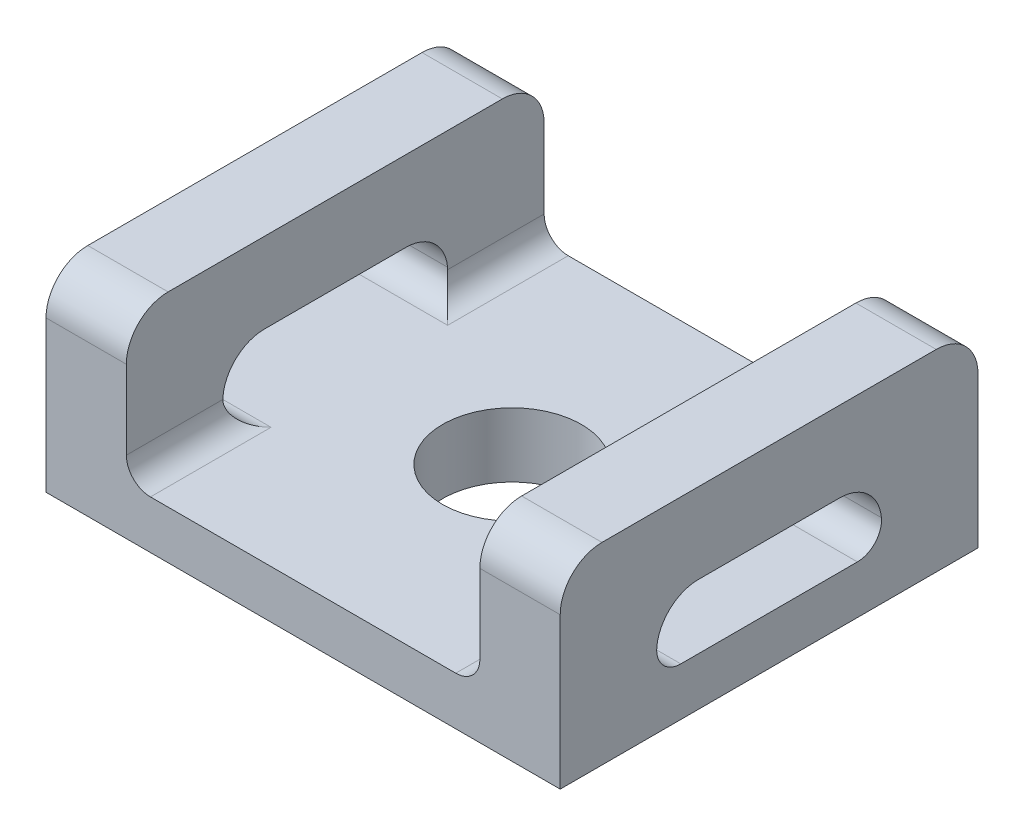
ISO-10303-21;
HEADER;
FILE_DESCRIPTION(('STEP AP214'),'2;1');
FILE_NAME('part.step','',(''),(''),'','','');
FILE_SCHEMA(('AUTOMOTIVE_DESIGN { 1 0 10303 214 1 1 1 1 }'));
ENDSEC;
DATA;
#1=APPLICATION_CONTEXT('core data for automotive mechanical design processes');
#2=APPLICATION_PROTOCOL_DEFINITION('international standard','automotive_design',2000,#1);
#3=PRODUCT_CONTEXT('',#1,'mechanical');
#4=PRODUCT('Part','Part','',(#3));
#5=PRODUCT_RELATED_PRODUCT_CATEGORY('part','',(#4));
#6=PRODUCT_DEFINITION_FORMATION('','',#4);
#7=PRODUCT_DEFINITION_CONTEXT('part definition',#1,'design');
#8=PRODUCT_DEFINITION('design','',#6,#7);
#9=PRODUCT_DEFINITION_SHAPE('','',#8);
#10=(LENGTH_UNIT() NAMED_UNIT(*) SI_UNIT(.MILLI.,.METRE.));
#11=(NAMED_UNIT(*) PLANE_ANGLE_UNIT() SI_UNIT($,.RADIAN.));
#12=(NAMED_UNIT(*) SI_UNIT($,.STERADIAN.) SOLID_ANGLE_UNIT());
#13=UNCERTAINTY_MEASURE_WITH_UNIT(LENGTH_MEASURE(1.E-05),#10,'distance_accuracy_value','');
#14=(GEOMETRIC_REPRESENTATION_CONTEXT(3) GLOBAL_UNCERTAINTY_ASSIGNED_CONTEXT((#13)) GLOBAL_UNIT_ASSIGNED_CONTEXT((#10,
#11,#12)) REPRESENTATION_CONTEXT('',''));
#15=CARTESIAN_POINT('',(0.,0.,0.));
#16=DIRECTION('',(0.,0.,1.));
#17=DIRECTION('',(1.,0.,0.));
#18=AXIS2_PLACEMENT_3D('',#15,#16,#17);
#19=CARTESIAN_POINT('',(-8.,5.2,5.2));
#20=DIRECTION('',(1.,0.,0.));
#21=DIRECTION('',(0.,0.,-1.));
#22=AXIS2_PLACEMENT_3D('',#19,#20,#21);
#23=CYLINDRICAL_SURFACE('',#22,1.3);
#24=DIRECTION('',(1.,0.,0.));
#25=VECTOR('',#24,1.);
#26=CARTESIAN_POINT('',(-8.,5.2,6.5));
#27=LINE('',#26,#25);
#28=CARTESIAN_POINT('',(-8.,5.2,6.5));
#29=VERTEX_POINT('',#28);
#30=CARTESIAN_POINT('',(-5.5,5.2,6.5));
#31=VERTEX_POINT('',#30);
#32=EDGE_CURVE('E290',#29,#31,#27,.T.);
#33=ORIENTED_EDGE('',*,*,#32,.T.);
#34=CARTESIAN_POINT('',(-5.5,5.2,5.2));
#35=DIRECTION('',(-1.,0.,0.));
#36=DIRECTION('',(0.,-1.,0.));
#37=AXIS2_PLACEMENT_3D('',#34,#35,#36);
#38=CIRCLE('',#37,1.3);
#39=CARTESIAN_POINT('',(-5.5,6.5,5.2));
#40=VERTEX_POINT('',#39);
#41=EDGE_CURVE('E508',#31,#40,#38,.T.);
#42=ORIENTED_EDGE('',*,*,#41,.T.);
#43=DIRECTION('',(1.,0.,0.));
#44=VECTOR('',#43,1.);
#45=CARTESIAN_POINT('',(-8.,6.5,5.2));
#46=LINE('',#45,#44);
#47=CARTESIAN_POINT('',(-8.,6.5,5.2));
#48=VERTEX_POINT('',#47);
#49=EDGE_CURVE('E304',#48,#40,#46,.T.);
#50=ORIENTED_EDGE('',*,*,#49,.F.);
#51=CARTESIAN_POINT('',(-8.,5.2,5.2));
#52=DIRECTION('',(1.,0.,0.));
#53=DIRECTION('',(0.,0.,-1.));
#54=AXIS2_PLACEMENT_3D('',#51,#52,#53);
#55=CIRCLE('',#54,1.3);
#56=EDGE_CURVE('E495',#29,#48,#55,.F.);
#57=ORIENTED_EDGE('',*,*,#56,.F.);
#58=EDGE_LOOP('',(#33,#42,#50,#57));
#59=FACE_BOUND('',#58,.T.);
#60=ADVANCED_FACE('F43',(#59),#23,.T.);
#61=CARTESIAN_POINT('',(-8.,6.5,0.));
#62=DIRECTION('',(0.,-1.,0.));
#63=DIRECTION('',(0.,0.,-1.));
#64=AXIS2_PLACEMENT_3D('',#61,#62,#63);
#65=PLANE('',#64);
#66=ORIENTED_EDGE('',*,*,#49,.T.);
#67=DIRECTION('',(0.,0.,-1.));
#68=VECTOR('',#67,1.);
#69=CARTESIAN_POINT('',(-5.5,6.5,0.));
#70=LINE('',#69,#68);
#71=CARTESIAN_POINT('',(-5.5,6.5,-5.2));
#72=VERTEX_POINT('',#71);
#73=EDGE_CURVE('E553',#40,#72,#70,.T.);
#74=ORIENTED_EDGE('',*,*,#73,.T.);
#75=DIRECTION('',(1.,0.,0.));
#76=VECTOR('',#75,1.);
#77=CARTESIAN_POINT('',(-8.,6.5,-5.2));
#78=LINE('',#77,#76);
#79=CARTESIAN_POINT('',(-8.,6.5,-5.2));
#80=VERTEX_POINT('',#79);
#81=EDGE_CURVE('E282',#80,#72,#78,.T.);
#82=ORIENTED_EDGE('',*,*,#81,.F.);
#83=DIRECTION('',(0.,0.,-1.));
#84=VECTOR('',#83,1.);
#85=CARTESIAN_POINT('',(-8.,6.5,0.));
#86=LINE('',#85,#84);
#87=EDGE_CURVE('E498',#48,#80,#86,.T.);
#88=ORIENTED_EDGE('',*,*,#87,.F.);
#89=EDGE_LOOP('',(#66,#74,#82,#88));
#90=FACE_BOUND('',#89,.T.);
#91=ADVANCED_FACE('F647',(#90),#65,.F.);
#92=CARTESIAN_POINT('',(-8.,5.2,-5.2));
#93=DIRECTION('',(1.,0.,0.));
#94=DIRECTION('',(0.,0.,-1.));
#95=AXIS2_PLACEMENT_3D('',#92,#93,#94);
#96=CYLINDRICAL_SURFACE('',#95,1.3);
#97=ORIENTED_EDGE('',*,*,#81,.T.);
#98=CARTESIAN_POINT('',(-5.5,5.2,-5.2));
#99=DIRECTION('',(-1.,0.,0.));
#100=DIRECTION('',(0.,-1.,0.));
#101=AXIS2_PLACEMENT_3D('',#98,#99,#100);
#102=CIRCLE('',#101,1.3);
#103=CARTESIAN_POINT('',(-5.5,5.2,-6.5));
#104=VERTEX_POINT('',#103);
#105=EDGE_CURVE('E556',#72,#104,#102,.T.);
#106=ORIENTED_EDGE('',*,*,#105,.T.);
#107=DIRECTION('',(1.,0.,0.));
#108=VECTOR('',#107,1.);
#109=CARTESIAN_POINT('',(-8.,5.2,-6.5));
#110=LINE('',#109,#108);
#111=CARTESIAN_POINT('',(-8.,5.2,-6.5));
#112=VERTEX_POINT('',#111);
#113=EDGE_CURVE('E271',#112,#104,#110,.T.);
#114=ORIENTED_EDGE('',*,*,#113,.F.);
#115=CARTESIAN_POINT('',(-8.,5.2,-5.2));
#116=DIRECTION('',(1.,0.,0.));
#117=DIRECTION('',(0.,0.,-1.));
#118=AXIS2_PLACEMENT_3D('',#115,#116,#117);
#119=CIRCLE('',#118,1.3);
#120=EDGE_CURVE('E536',#80,#112,#119,.F.);
#121=ORIENTED_EDGE('',*,*,#120,.F.);
#122=EDGE_LOOP('',(#97,#106,#114,#121));
#123=FACE_BOUND('',#122,.T.);
#124=ADVANCED_FACE('F646',(#123),#96,.T.);
#125=CARTESIAN_POINT('',(-8.,2.7,-2.2));
#126=DIRECTION('',(1.,0.,0.));
#127=DIRECTION('',(0.,0.,-1.));
#128=AXIS2_PLACEMENT_3D('',#125,#126,#127);
#129=CYLINDRICAL_SURFACE('',#128,1.3);
#130=CARTESIAN_POINT('',(-8.,2.7,-2.2));
#131=DIRECTION('',(1.,0.,0.));
#132=DIRECTION('',(0.,0.,-1.));
#133=AXIS2_PLACEMENT_3D('',#130,#131,#132);
#134=CIRCLE('',#133,1.3);
#135=CARTESIAN_POINT('',(-8.,2.81818181818182,-3.49461695410312));
#136=VERTEX_POINT('',#135);
#137=CARTESIAN_POINT('',(-8.,4.,-2.2));
#138=VERTEX_POINT('',#137);
#139=EDGE_CURVE('E539',#136,#138,#134,.T.);
#140=ORIENTED_EDGE('',*,*,#139,.F.);
#141=DIRECTION('',(1.,0.,0.));
#142=VECTOR('',#141,1.);
#143=CARTESIAN_POINT('',(-8.,2.81818181818182,-3.49461695410312));
#144=LINE('',#143,#142);
#145=CARTESIAN_POINT('',(-5.5,2.81818181818182,-3.49461695410312));
#146=VERTEX_POINT('',#145);
#147=EDGE_CURVE('E373',#136,#146,#144,.T.);
#148=ORIENTED_EDGE('',*,*,#147,.T.);
#149=CARTESIAN_POINT('',(-5.5,2.7,-2.2));
#150=DIRECTION('',(-1.,0.,0.));
#151=DIRECTION('',(0.,-1.,0.));
#152=AXIS2_PLACEMENT_3D('',#149,#150,#151);
#153=CIRCLE('',#152,1.3);
#154=CARTESIAN_POINT('',(-5.5,4.,-2.2));
#155=VERTEX_POINT('',#154);
#156=EDGE_CURVE('E560',#146,#155,#153,.F.);
#157=ORIENTED_EDGE('',*,*,#156,.T.);
#158=DIRECTION('',(1.,0.,0.));
#159=VECTOR('',#158,1.);
#160=CARTESIAN_POINT('',(-8.,4.,-2.2));
#161=LINE('',#160,#159);
#162=EDGE_CURVE('E272',#138,#155,#161,.T.);
#163=ORIENTED_EDGE('',*,*,#162,.F.);
#164=EDGE_LOOP('',(#140,#148,#157,#163));
#165=FACE_BOUND('',#164,.T.);
#166=ADVANCED_FACE('F678',(#165),#129,.F.);
#167=CARTESIAN_POINT('',(-8.,4.,0.));
#168=DIRECTION('',(0.,-1.,0.));
#169=DIRECTION('',(0.,0.,-1.));
#170=AXIS2_PLACEMENT_3D('',#167,#168,#169);
#171=PLANE('',#170);
#172=DIRECTION('',(0.,0.,-1.));
#173=VECTOR('',#172,1.);
#174=CARTESIAN_POINT('',(-5.5,4.,0.));
#175=LINE('',#174,#173);
#176=CARTESIAN_POINT('',(-5.5,4.,2.2));
#177=VERTEX_POINT('',#176);
#178=EDGE_CURVE('E563',#177,#155,#175,.T.);
#179=ORIENTED_EDGE('',*,*,#178,.F.);
#180=DIRECTION('',(1.,0.,0.));
#181=VECTOR('',#180,1.);
#182=CARTESIAN_POINT('',(-8.,4.,2.2));
#183=LINE('',#182,#181);
#184=CARTESIAN_POINT('',(-8.,4.,2.2));
#185=VERTEX_POINT('',#184);
#186=EDGE_CURVE('E285',#185,#177,#183,.T.);
#187=ORIENTED_EDGE('',*,*,#186,.F.);
#188=DIRECTION('',(0.,0.,-1.));
#189=VECTOR('',#188,1.);
#190=CARTESIAN_POINT('',(-8.,4.,0.));
#191=LINE('',#190,#189);
#192=EDGE_CURVE('E542',#185,#138,#191,.T.);
#193=ORIENTED_EDGE('',*,*,#192,.T.);
#194=ORIENTED_EDGE('',*,*,#162,.T.);
#195=EDGE_LOOP('',(#179,#187,#193,#194));
#196=FACE_BOUND('',#195,.T.);
#197=ADVANCED_FACE('F667',(#196),#171,.T.);
#198=CARTESIAN_POINT('',(-8.,2.7,2.2));
#199=DIRECTION('',(1.,0.,0.));
#200=DIRECTION('',(0.,0.,-1.));
#201=AXIS2_PLACEMENT_3D('',#198,#199,#200);
#202=CYLINDRICAL_SURFACE('',#201,1.3);
#203=CARTESIAN_POINT('',(-5.5,2.7,2.2));
#204=DIRECTION('',(-1.,0.,0.));
#205=DIRECTION('',(0.,-1.,0.));
#206=AXIS2_PLACEMENT_3D('',#203,#204,#205);
#207=CIRCLE('',#206,1.3);
#208=CARTESIAN_POINT('',(-5.5,2.81818181818182,3.49461695410312));
#209=VERTEX_POINT('',#208);
#210=EDGE_CURVE('E567',#177,#209,#207,.F.);
#211=ORIENTED_EDGE('',*,*,#210,.T.);
#212=DIRECTION('',(1.,0.,0.));
#213=VECTOR('',#212,1.);
#214=CARTESIAN_POINT('',(-8.,2.81818181818182,3.49461695410312));
#215=LINE('',#214,#213);
#216=CARTESIAN_POINT('',(-8.,2.81818181818182,3.49461695410312));
#217=VERTEX_POINT('',#216);
#218=EDGE_CURVE('E358',#209,#217,#215,.F.);
#219=ORIENTED_EDGE('',*,*,#218,.T.);
#220=CARTESIAN_POINT('',(-8.,2.7,2.2));
#221=DIRECTION('',(1.,0.,0.));
#222=DIRECTION('',(0.,0.,-1.));
#223=AXIS2_PLACEMENT_3D('',#220,#221,#222);
#224=CIRCLE('',#223,1.3);
#225=EDGE_CURVE('E502',#185,#217,#224,.T.);
#226=ORIENTED_EDGE('',*,*,#225,.F.);
#227=ORIENTED_EDGE('',*,*,#186,.T.);
#228=EDGE_LOOP('',(#211,#219,#226,#227));
#229=FACE_BOUND('',#228,.T.);
#230=ADVANCED_FACE('F663',(#229),#202,.F.);
#231=CARTESIAN_POINT('',(0.,2.,0.));
#232=DIRECTION('',(0.,-1.,0.));
#233=DIRECTION('',(0.,0.,-1.));
#234=AXIS2_PLACEMENT_3D('',#231,#232,#233);
#235=PLANE('',#234);
#236=DIRECTION('',(-1.,0.,0.));
#237=VECTOR('',#236,1.);
#238=CARTESIAN_POINT('',(-5.5,2.,2.74772255750517));
#239=LINE('',#238,#237);
#240=CARTESIAN_POINT('',(-8.,2.,2.74772255750517));
#241=VERTEX_POINT('',#240);
#242=CARTESIAN_POINT('',(-4.75,2.,2.74772255750517));
#243=VERTEX_POINT('',#242);
#244=EDGE_CURVE('E345',#241,#243,#239,.F.);
#245=ORIENTED_EDGE('',*,*,#244,.T.);
#246=DIRECTION('',(0.,0.,1.));
#247=VECTOR('',#246,1.);
#248=CARTESIAN_POINT('',(-4.75,2.,6.5));
#249=LINE('',#248,#247);
#250=CARTESIAN_POINT('',(-4.75,2.,6.5));
#251=VERTEX_POINT('',#250);
#252=EDGE_CURVE('E348',#243,#251,#249,.T.);
#253=ORIENTED_EDGE('',*,*,#252,.T.);
#254=DIRECTION('',(-1.,0.,0.));
#255=VECTOR('',#254,1.);
#256=CARTESIAN_POINT('',(-8.,2.,6.5));
#257=LINE('',#256,#255);
#258=CARTESIAN_POINT('',(4.75,2.,6.5));
#259=VERTEX_POINT('',#258);
#260=EDGE_CURVE('E252',#259,#251,#257,.T.);
#261=ORIENTED_EDGE('',*,*,#260,.F.);
#262=DIRECTION('',(0.,0.,1.));
#263=VECTOR('',#262,1.);
#264=CARTESIAN_POINT('',(4.75,2.,3.5));
#265=LINE('',#264,#263);
#266=CARTESIAN_POINT('',(4.75,2.,2.74772255750517));
#267=VERTEX_POINT('',#266);
#268=EDGE_CURVE('E338',#259,#267,#265,.F.);
#269=ORIENTED_EDGE('',*,*,#268,.T.);
#270=DIRECTION('',(-1.,0.,0.));
#271=VECTOR('',#270,1.);
#272=CARTESIAN_POINT('',(8.,2.,2.74772255750517));
#273=LINE('',#272,#271);
#274=CARTESIAN_POINT('',(8.,2.,2.74772255750517));
#275=VERTEX_POINT('',#274);
#276=EDGE_CURVE('E341',#267,#275,#273,.F.);
#277=ORIENTED_EDGE('',*,*,#276,.T.);
#278=DIRECTION('',(0.,0.,-1.));
#279=VECTOR('',#278,1.);
#280=CARTESIAN_POINT('',(8.,2.,6.5));
#281=LINE('',#280,#279);
#282=CARTESIAN_POINT('',(8.,2.,-2.74772255750516));
#283=VERTEX_POINT('',#282);
#284=EDGE_CURVE('E299',#275,#283,#281,.T.);
#285=ORIENTED_EDGE('',*,*,#284,.T.);
#286=DIRECTION('',(-1.,0.,0.));
#287=VECTOR('',#286,1.);
#288=CARTESIAN_POINT('',(5.5,2.,-2.74772255750516));
#289=LINE('',#288,#287);
#290=CARTESIAN_POINT('',(4.75,2.,-2.74772255750516));
#291=VERTEX_POINT('',#290);
#292=EDGE_CURVE('E332',#283,#291,#289,.T.);
#293=ORIENTED_EDGE('',*,*,#292,.T.);
#294=DIRECTION('',(0.,0.,1.));
#295=VECTOR('',#294,1.);
#296=CARTESIAN_POINT('',(4.75,2.,-6.5));
#297=LINE('',#296,#295);
#298=CARTESIAN_POINT('',(4.75,2.,-6.5));
#299=VERTEX_POINT('',#298);
#300=EDGE_CURVE('E335',#291,#299,#297,.F.);
#301=ORIENTED_EDGE('',*,*,#300,.T.);
#302=DIRECTION('',(1.,0.,0.));
#303=VECTOR('',#302,1.);
#304=CARTESIAN_POINT('',(-5.5,2.,-6.5));
#305=LINE('',#304,#303);
#306=CARTESIAN_POINT('',(-4.75,2.,-6.5));
#307=VERTEX_POINT('',#306);
#308=EDGE_CURVE('E253',#307,#299,#305,.T.);
#309=ORIENTED_EDGE('',*,*,#308,.F.);
#310=DIRECTION('',(0.,0.,1.));
#311=VECTOR('',#310,1.);
#312=CARTESIAN_POINT('',(-4.75,2.,-3.5));
#313=LINE('',#312,#311);
#314=CARTESIAN_POINT('',(-4.75,2.,-2.74772255750516));
#315=VERTEX_POINT('',#314);
#316=EDGE_CURVE('E328',#307,#315,#313,.T.);
#317=ORIENTED_EDGE('',*,*,#316,.T.);
#318=DIRECTION('',(-1.,0.,0.));
#319=VECTOR('',#318,1.);
#320=CARTESIAN_POINT('',(-8.,2.,-2.74772255750516));
#321=LINE('',#320,#319);
#322=CARTESIAN_POINT('',(-8.,2.,-2.74772255750516));
#323=VERTEX_POINT('',#322);
#324=EDGE_CURVE('E325',#315,#323,#321,.T.);
#325=ORIENTED_EDGE('',*,*,#324,.T.);
#326=DIRECTION('',(0.,0.,1.));
#327=VECTOR('',#326,1.);
#328=CARTESIAN_POINT('',(-8.,2.,6.5));
#329=LINE('',#328,#327);
#330=EDGE_CURVE('E308',#323,#241,#329,.T.);
#331=ORIENTED_EDGE('',*,*,#330,.T.);
#332=EDGE_LOOP('',(#245,#253,#261,#269,#277,#285,#293,#301,#309,#317,#325,#331));
#333=FACE_BOUND('',#332,.T.);
#334=CARTESIAN_POINT('',(0.,2.,0.));
#335=DIRECTION('',(0.,1.,0.));
#336=DIRECTION('',(0.,0.,1.));
#337=AXIS2_PLACEMENT_3D('',#334,#335,#336);
#338=CIRCLE('',#337,2.159);
#339=CARTESIAN_POINT('',(0.,2.,2.159));
#340=VERTEX_POINT('',#339);
#341=EDGE_CURVE('E295',#340,#340,#338,.T.);
#342=ORIENTED_EDGE('',*,*,#341,.F.);
#343=EDGE_LOOP('',(#342));
#344=FACE_BOUND('',#343,.T.);
#345=ADVANCED_FACE('F607',(#333,#344),#235,.F.);
#346=CARTESIAN_POINT('',(0.,0.,0.));
#347=DIRECTION('',(0.,-1.,0.));
#348=DIRECTION('',(0.,0.,-1.));
#349=AXIS2_PLACEMENT_3D('',#346,#347,#348);
#350=PLANE('',#349);
#351=DIRECTION('',(1.,0.,0.));
#352=VECTOR('',#351,1.);
#353=CARTESIAN_POINT('',(8.,0.,-6.));
#354=LINE('',#353,#352);
#355=CARTESIAN_POINT('',(-7.5,0.,-6.));
#356=VERTEX_POINT('',#355);
#357=CARTESIAN_POINT('',(7.5,0.,-6.));
#358=VERTEX_POINT('',#357);
#359=EDGE_CURVE('E432',#356,#358,#354,.T.);
#360=ORIENTED_EDGE('',*,*,#359,.T.);
#361=DIRECTION('',(0.,0.,1.));
#362=VECTOR('',#361,1.);
#363=CARTESIAN_POINT('',(7.5,0.,6.5));
#364=LINE('',#363,#362);
#365=CARTESIAN_POINT('',(7.5,0.,6.));
#366=VERTEX_POINT('',#365);
#367=EDGE_CURVE('E441',#358,#366,#364,.T.);
#368=ORIENTED_EDGE('',*,*,#367,.T.);
#369=DIRECTION('',(-1.,0.,0.));
#370=VECTOR('',#369,1.);
#371=CARTESIAN_POINT('',(-8.,0.,6.));
#372=LINE('',#371,#370);
#373=CARTESIAN_POINT('',(-7.5,0.,6.));
#374=VERTEX_POINT('',#373);
#375=EDGE_CURVE('E438',#366,#374,#372,.T.);
#376=ORIENTED_EDGE('',*,*,#375,.T.);
#377=DIRECTION('',(0.,0.,-1.));
#378=VECTOR('',#377,1.);
#379=CARTESIAN_POINT('',(-7.5,0.,-6.5));
#380=LINE('',#379,#378);
#381=EDGE_CURVE('E435',#374,#356,#380,.T.);
#382=ORIENTED_EDGE('',*,*,#381,.T.);
#383=EDGE_LOOP('',(#360,#368,#376,#382));
#384=FACE_BOUND('',#383,.T.);
#385=CARTESIAN_POINT('',(0.,0.,0.));
#386=DIRECTION('',(0.,1.,0.));
#387=DIRECTION('',(0.,0.,1.));
#388=AXIS2_PLACEMENT_3D('',#385,#386,#387);
#389=CIRCLE('',#388,2.159);
#390=CARTESIAN_POINT('',(0.,0.,2.159));
#391=VERTEX_POINT('',#390);
#392=EDGE_CURVE('E300',#391,#391,#389,.T.);
#393=ORIENTED_EDGE('',*,*,#392,.T.);
#394=EDGE_LOOP('',(#393));
#395=FACE_BOUND('',#394,.T.);
#396=ADVANCED_FACE('F472',(#384,#395),#350,.T.);
#397=CARTESIAN_POINT('',(8.,2.,6.5));
#398=DIRECTION('',(-1.,0.,0.));
#399=DIRECTION('',(0.,0.,1.));
#400=AXIS2_PLACEMENT_3D('',#397,#398,#399);
#401=PLANE('',#400);
#402=CARTESIAN_POINT('',(8.,2.7,-2.2));
#403=DIRECTION('',(1.,0.,0.));
#404=DIRECTION('',(0.,0.,-1.));
#405=AXIS2_PLACEMENT_3D('',#402,#403,#404);
#406=CIRCLE('',#405,1.3);
#407=CARTESIAN_POINT('',(8.,2.81818181818182,-3.49461695410312));
#408=VERTEX_POINT('',#407);
#409=CARTESIAN_POINT('',(8.,4.,-2.2));
#410=VERTEX_POINT('',#409);
#411=EDGE_CURVE('E520',#408,#410,#406,.T.);
#412=ORIENTED_EDGE('',*,*,#411,.F.);
#413=CARTESIAN_POINT('',(8.,2.75,-2.74772255750516));
#414=DIRECTION('',(-1.,0.,0.));
#415=DIRECTION('',(0.,0.,1.));
#416=AXIS2_PLACEMENT_3D('',#413,#414,#415);
#417=CIRCLE('',#416,0.75);
#418=EDGE_CURVE('E396',#408,#283,#417,.T.);
#419=ORIENTED_EDGE('',*,*,#418,.T.);
#420=ORIENTED_EDGE('',*,*,#284,.F.);
#421=CARTESIAN_POINT('',(8.,2.75,2.74772255750517));
#422=DIRECTION('',(-1.,0.,0.));
#423=DIRECTION('',(0.,0.,1.));
#424=AXIS2_PLACEMENT_3D('',#421,#422,#423);
#425=CIRCLE('',#424,0.75);
#426=CARTESIAN_POINT('',(8.,2.81818181818182,3.49461695410312));
#427=VERTEX_POINT('',#426);
#428=EDGE_CURVE('E385',#275,#427,#425,.T.);
#429=ORIENTED_EDGE('',*,*,#428,.T.);
#430=CARTESIAN_POINT('',(8.,2.7,2.2));
#431=DIRECTION('',(1.,0.,0.));
#432=DIRECTION('',(0.,0.,-1.));
#433=AXIS2_PLACEMENT_3D('',#430,#431,#432);
#434=CIRCLE('',#433,1.3);
#435=CARTESIAN_POINT('',(8.,4.,2.2));
#436=VERTEX_POINT('',#435);
#437=EDGE_CURVE('E527',#436,#427,#434,.T.);
#438=ORIENTED_EDGE('',*,*,#437,.F.);
#439=DIRECTION('',(0.,0.,-1.));
#440=VECTOR('',#439,1.);
#441=CARTESIAN_POINT('',(8.,4.,0.));
#442=LINE('',#441,#440);
#443=EDGE_CURVE('E523',#436,#410,#442,.T.);
#444=ORIENTED_EDGE('',*,*,#443,.T.);
#445=EDGE_LOOP('',(#412,#419,#420,#429,#438,#444));
#446=FACE_BOUND('',#445,.T.);
#447=DIRECTION('',(0.,-1.,0.));
#448=VECTOR('',#447,1.);
#449=CARTESIAN_POINT('',(8.,2.,6.5));
#450=LINE('',#449,#448);
#451=CARTESIAN_POINT('',(8.,5.2,6.5));
#452=VERTEX_POINT('',#451);
#453=CARTESIAN_POINT('',(8.,0.5,6.5));
#454=VERTEX_POINT('',#453);
#455=EDGE_CURVE('E312',#452,#454,#450,.T.);
#456=ORIENTED_EDGE('',*,*,#455,.T.);
#457=DIRECTION('',(0.,0.,-1.));
#458=VECTOR('',#457,1.);
#459=CARTESIAN_POINT('',(8.,0.5,-6.5));
#460=LINE('',#459,#458);
#461=CARTESIAN_POINT('',(8.,0.5,-6.5));
#462=VERTEX_POINT('',#461);
#463=EDGE_CURVE('E412',#454,#462,#460,.T.);
#464=ORIENTED_EDGE('',*,*,#463,.T.);
#465=DIRECTION('',(0.,-1.,0.));
#466=VECTOR('',#465,1.);
#467=CARTESIAN_POINT('',(8.,2.,-6.5));
#468=LINE('',#467,#466);
#469=CARTESIAN_POINT('',(8.,5.2,-6.5));
#470=VERTEX_POINT('',#469);
#471=EDGE_CURVE('E322',#470,#462,#468,.T.);
#472=ORIENTED_EDGE('',*,*,#471,.F.);
#473=CARTESIAN_POINT('',(8.,5.2,-5.2));
#474=DIRECTION('',(1.,0.,0.));
#475=DIRECTION('',(0.,0.,-1.));
#476=AXIS2_PLACEMENT_3D('',#473,#474,#475);
#477=CIRCLE('',#476,1.3);
#478=CARTESIAN_POINT('',(8.,6.5,-5.2));
#479=VERTEX_POINT('',#478);
#480=EDGE_CURVE('E269',#479,#470,#477,.F.);
#481=ORIENTED_EDGE('',*,*,#480,.F.);
#482=DIRECTION('',(0.,0.,-1.));
#483=VECTOR('',#482,1.);
#484=CARTESIAN_POINT('',(8.,6.5,0.));
#485=LINE('',#484,#483);
#486=CARTESIAN_POINT('',(8.,6.5,5.2));
#487=VERTEX_POINT('',#486);
#488=EDGE_CURVE('E503',#487,#479,#485,.T.);
#489=ORIENTED_EDGE('',*,*,#488,.F.);
#490=CARTESIAN_POINT('',(8.,5.2,5.2));
#491=DIRECTION('',(1.,0.,0.));
#492=DIRECTION('',(0.,0.,-1.));
#493=AXIS2_PLACEMENT_3D('',#490,#491,#492);
#494=CIRCLE('',#493,1.3);
#495=EDGE_CURVE('E486',#452,#487,#494,.F.);
#496=ORIENTED_EDGE('',*,*,#495,.F.);
#497=EDGE_LOOP('',(#456,#464,#472,#481,#489,#496));
#498=FACE_BOUND('',#497,.T.);
#499=ADVANCED_FACE('F481',(#446,#498),#401,.F.);
#500=CARTESIAN_POINT('',(-8.,2.,-6.5));
#501=DIRECTION('',(0.,0.,1.));
#502=DIRECTION('',(1.,0.,0.));
#503=AXIS2_PLACEMENT_3D('',#500,#501,#502);
#504=PLANE('',#503);
#505=ORIENTED_EDGE('',*,*,#471,.T.);
#506=DIRECTION('',(-1.,0.,0.));
#507=VECTOR('',#506,1.);
#508=CARTESIAN_POINT('',(-8.,0.5,-6.5));
#509=LINE('',#508,#507);
#510=CARTESIAN_POINT('',(-8.,0.5,-6.5));
#511=VERTEX_POINT('',#510);
#512=EDGE_CURVE('E11',#462,#511,#509,.T.);
#513=ORIENTED_EDGE('',*,*,#512,.T.);
#514=DIRECTION('',(0.,-1.,0.));
#515=VECTOR('',#514,1.);
#516=CARTESIAN_POINT('',(-8.,2.,-6.5));
#517=LINE('',#516,#515);
#518=EDGE_CURVE('E319',#112,#511,#517,.T.);
#519=ORIENTED_EDGE('',*,*,#518,.F.);
#520=ORIENTED_EDGE('',*,*,#113,.T.);
#521=DIRECTION('',(0.,-1.,0.));
#522=VECTOR('',#521,1.);
#523=CARTESIAN_POINT('',(-5.5,7.,-6.5));
#524=LINE('',#523,#522);
#525=CARTESIAN_POINT('',(-5.5,2.75,-6.5));
#526=VERTEX_POINT('',#525);
#527=EDGE_CURVE('E417',#104,#526,#524,.T.);
#528=ORIENTED_EDGE('',*,*,#527,.T.);
#529=CARTESIAN_POINT('',(-4.75,2.75,-6.5));
#530=DIRECTION('',(0.,0.,1.));
#531=DIRECTION('',(1.,0.,0.));
#532=AXIS2_PLACEMENT_3D('',#529,#530,#531);
#533=CIRCLE('',#532,0.75);
#534=EDGE_CURVE('E402',#526,#307,#533,.T.);
#535=ORIENTED_EDGE('',*,*,#534,.T.);
#536=ORIENTED_EDGE('',*,*,#308,.T.);
#537=CARTESIAN_POINT('',(4.75,2.75,-6.5));
#538=DIRECTION('',(0.,0.,1.));
#539=DIRECTION('',(1.,0.,0.));
#540=AXIS2_PLACEMENT_3D('',#537,#538,#539);
#541=CIRCLE('',#540,0.75);
#542=CARTESIAN_POINT('',(5.5,2.75,-6.5));
#543=VERTEX_POINT('',#542);
#544=EDGE_CURVE('E248',#299,#543,#541,.T.);
#545=ORIENTED_EDGE('',*,*,#544,.T.);
#546=DIRECTION('',(0.,1.,0.));
#547=VECTOR('',#546,1.);
#548=CARTESIAN_POINT('',(5.5,7.,-6.5));
#549=LINE('',#548,#547);
#550=CARTESIAN_POINT('',(5.5,5.2,-6.5));
#551=VERTEX_POINT('',#550);
#552=EDGE_CURVE('E240',#543,#551,#549,.T.);
#553=ORIENTED_EDGE('',*,*,#552,.T.);
#554=EDGE_CURVE('E244',#551,#470,#110,.T.);
#555=ORIENTED_EDGE('',*,*,#554,.T.);
#556=EDGE_LOOP('',(#505,#513,#519,#520,#528,#535,#536,#545,#553,#555));
#557=FACE_BOUND('',#556,.T.);
#558=ADVANCED_FACE('F242',(#557),#504,.F.);
#559=CARTESIAN_POINT('',(-8.,2.,6.5));
#560=DIRECTION('',(1.,0.,0.));
#561=DIRECTION('',(0.,0.,-1.));
#562=AXIS2_PLACEMENT_3D('',#559,#560,#561);
#563=PLANE('',#562);
#564=ORIENTED_EDGE('',*,*,#330,.F.);
#565=CARTESIAN_POINT('',(-8.,2.75,-2.74772255750516));
#566=DIRECTION('',(1.,0.,0.));
#567=DIRECTION('',(0.,0.,-1.));
#568=AXIS2_PLACEMENT_3D('',#565,#566,#567);
#569=CIRCLE('',#568,0.75);
#570=EDGE_CURVE('E409',#323,#136,#569,.T.);
#571=ORIENTED_EDGE('',*,*,#570,.T.);
#572=ORIENTED_EDGE('',*,*,#139,.T.);
#573=ORIENTED_EDGE('',*,*,#192,.F.);
#574=ORIENTED_EDGE('',*,*,#225,.T.);
#575=CARTESIAN_POINT('',(-8.,2.75,2.74772255750517));
#576=DIRECTION('',(1.,0.,0.));
#577=DIRECTION('',(0.,0.,-1.));
#578=AXIS2_PLACEMENT_3D('',#575,#576,#577);
#579=CIRCLE('',#578,0.75);
#580=EDGE_CURVE('E382',#217,#241,#579,.T.);
#581=ORIENTED_EDGE('',*,*,#580,.T.);
#582=EDGE_LOOP('',(#564,#571,#572,#573,#574,#581));
#583=FACE_BOUND('',#582,.T.);
#584=ORIENTED_EDGE('',*,*,#518,.T.);
#585=DIRECTION('',(0.,0.,1.));
#586=VECTOR('',#585,1.);
#587=CARTESIAN_POINT('',(-8.,0.5,6.5));
#588=LINE('',#587,#586);
#589=CARTESIAN_POINT('',(-8.,0.5,6.5));
#590=VERTEX_POINT('',#589);
#591=EDGE_CURVE('E54',#511,#590,#588,.T.);
#592=ORIENTED_EDGE('',*,*,#591,.T.);
#593=DIRECTION('',(0.,-1.,0.));
#594=VECTOR('',#593,1.);
#595=CARTESIAN_POINT('',(-8.,2.,6.5));
#596=LINE('',#595,#594);
#597=EDGE_CURVE('E316',#29,#590,#596,.T.);
#598=ORIENTED_EDGE('',*,*,#597,.F.);
#599=ORIENTED_EDGE('',*,*,#56,.T.);
#600=ORIENTED_EDGE('',*,*,#87,.T.);
#601=ORIENTED_EDGE('',*,*,#120,.T.);
#602=EDGE_LOOP('',(#584,#592,#598,#599,#600,#601));
#603=FACE_BOUND('',#602,.T.);
#604=ADVANCED_FACE('F494',(#583,#603),#563,.F.);
#605=CARTESIAN_POINT('',(-8.,2.,6.5));
#606=DIRECTION('',(0.,0.,-1.));
#607=DIRECTION('',(-1.,0.,0.));
#608=AXIS2_PLACEMENT_3D('',#605,#606,#607);
#609=PLANE('',#608);
#610=ORIENTED_EDGE('',*,*,#597,.T.);
#611=DIRECTION('',(1.,0.,0.));
#612=VECTOR('',#611,1.);
#613=CARTESIAN_POINT('',(8.,0.5,6.5));
#614=LINE('',#613,#612);
#615=EDGE_CURVE('E445',#590,#454,#614,.T.);
#616=ORIENTED_EDGE('',*,*,#615,.T.);
#617=ORIENTED_EDGE('',*,*,#455,.F.);
#618=CARTESIAN_POINT('',(5.5,5.2,6.5));
#619=VERTEX_POINT('',#618);
#620=EDGE_CURVE('E294',#619,#452,#27,.T.);
#621=ORIENTED_EDGE('',*,*,#620,.F.);
#622=DIRECTION('',(0.,-1.,0.));
#623=VECTOR('',#622,1.);
#624=CARTESIAN_POINT('',(5.5,2.,6.5));
#625=LINE('',#624,#623);
#626=CARTESIAN_POINT('',(5.5,2.75,6.5));
#627=VERTEX_POINT('',#626);
#628=EDGE_CURVE('E571',#619,#627,#625,.T.);
#629=ORIENTED_EDGE('',*,*,#628,.T.);
#630=CARTESIAN_POINT('',(4.75,2.75,6.5));
#631=DIRECTION('',(0.,0.,-1.));
#632=DIRECTION('',(-1.,0.,0.));
#633=AXIS2_PLACEMENT_3D('',#630,#631,#632);
#634=CIRCLE('',#633,0.75);
#635=EDGE_CURVE('E391',#627,#259,#634,.T.);
#636=ORIENTED_EDGE('',*,*,#635,.T.);
#637=ORIENTED_EDGE('',*,*,#260,.T.);
#638=CARTESIAN_POINT('',(-4.75,2.75,6.5));
#639=DIRECTION('',(0.,0.,-1.));
#640=DIRECTION('',(-1.,0.,0.));
#641=AXIS2_PLACEMENT_3D('',#638,#639,#640);
#642=CIRCLE('',#641,0.75);
#643=CARTESIAN_POINT('',(-5.5,2.75,6.5));
#644=VERTEX_POINT('',#643);
#645=EDGE_CURVE('E376',#251,#644,#642,.T.);
#646=ORIENTED_EDGE('',*,*,#645,.T.);
#647=DIRECTION('',(0.,1.,0.));
#648=VECTOR('',#647,1.);
#649=CARTESIAN_POINT('',(-5.5,2.,6.5));
#650=LINE('',#649,#648);
#651=EDGE_CURVE('E533',#644,#31,#650,.T.);
#652=ORIENTED_EDGE('',*,*,#651,.T.);
#653=ORIENTED_EDGE('',*,*,#32,.F.);
#654=EDGE_LOOP('',(#610,#616,#617,#621,#629,#636,#637,#646,#652,#653));
#655=FACE_BOUND('',#654,.T.);
#656=ADVANCED_FACE('F489',(#655),#609,.F.);
#657=CARTESIAN_POINT('',(0.,2.,0.));
#658=DIRECTION('',(0.,-1.,0.));
#659=DIRECTION('',(0.,0.,-1.));
#660=AXIS2_PLACEMENT_3D('',#657,#658,#659);
#661=CYLINDRICAL_SURFACE('',#660,2.159);
#662=ORIENTED_EDGE('',*,*,#341,.T.);
#663=EDGE_LOOP('',(#662));
#664=FACE_BOUND('',#663,.T.);
#665=ORIENTED_EDGE('',*,*,#392,.F.);
#666=EDGE_LOOP('',(#665));
#667=FACE_BOUND('',#666,.T.);
#668=ADVANCED_FACE('F697',(#664,#667),#661,.F.);
#669=CARTESIAN_POINT('',(5.5,6.5,5.2));
#670=VERTEX_POINT('',#669);
#671=EDGE_CURVE('E512',#670,#487,#46,.T.);
#672=ORIENTED_EDGE('',*,*,#671,.F.);
#673=CARTESIAN_POINT('',(5.5,5.2,5.2));
#674=DIRECTION('',(1.,0.,0.));
#675=DIRECTION('',(0.,1.,0.));
#676=AXIS2_PLACEMENT_3D('',#673,#674,#675);
#677=CIRCLE('',#676,1.3);
#678=EDGE_CURVE('E574',#670,#619,#677,.T.);
#679=ORIENTED_EDGE('',*,*,#678,.T.);
#680=ORIENTED_EDGE('',*,*,#620,.T.);
#681=ORIENTED_EDGE('',*,*,#495,.T.);
#682=EDGE_LOOP('',(#672,#679,#680,#681));
#683=FACE_BOUND('',#682,.T.);
#684=ADVANCED_FACE('F638',(#683),#23,.T.);
#685=CARTESIAN_POINT('',(5.5,6.5,-5.2));
#686=VERTEX_POINT('',#685);
#687=EDGE_CURVE('E277',#686,#479,#78,.T.);
#688=ORIENTED_EDGE('',*,*,#687,.F.);
#689=DIRECTION('',(0.,0.,1.));
#690=VECTOR('',#689,1.);
#691=CARTESIAN_POINT('',(5.5,6.5,0.));
#692=LINE('',#691,#690);
#693=EDGE_CURVE('E260',#686,#670,#692,.T.);
#694=ORIENTED_EDGE('',*,*,#693,.T.);
#695=ORIENTED_EDGE('',*,*,#671,.T.);
#696=ORIENTED_EDGE('',*,*,#488,.T.);
#697=EDGE_LOOP('',(#688,#694,#695,#696));
#698=FACE_BOUND('',#697,.T.);
#699=ADVANCED_FACE('F640',(#698),#65,.F.);
#700=ORIENTED_EDGE('',*,*,#554,.F.);
#701=CARTESIAN_POINT('',(5.5,5.2,-5.2));
#702=DIRECTION('',(1.,0.,0.));
#703=DIRECTION('',(0.,1.,0.));
#704=AXIS2_PLACEMENT_3D('',#701,#702,#703);
#705=CIRCLE('',#704,1.3);
#706=EDGE_CURVE('E256',#551,#686,#705,.T.);
#707=ORIENTED_EDGE('',*,*,#706,.T.);
#708=ORIENTED_EDGE('',*,*,#687,.T.);
#709=ORIENTED_EDGE('',*,*,#480,.T.);
#710=EDGE_LOOP('',(#700,#707,#708,#709));
#711=FACE_BOUND('',#710,.T.);
#712=ADVANCED_FACE('F267',(#711),#96,.T.);
#713=CARTESIAN_POINT('',(5.5,2.7,-2.2));
#714=DIRECTION('',(1.,0.,0.));
#715=DIRECTION('',(0.,1.,0.));
#716=AXIS2_PLACEMENT_3D('',#713,#714,#715);
#717=CIRCLE('',#716,1.3);
#718=CARTESIAN_POINT('',(5.5,4.,-2.2));
#719=VERTEX_POINT('',#718);
#720=CARTESIAN_POINT('',(5.5,2.81818181818182,-3.49461695410312));
#721=VERTEX_POINT('',#720);
#722=EDGE_CURVE('E264',#719,#721,#717,.F.);
#723=ORIENTED_EDGE('',*,*,#722,.T.);
#724=DIRECTION('',(1.,0.,0.));
#725=VECTOR('',#724,1.);
#726=CARTESIAN_POINT('',(-8.,2.81818181818182,-3.49461695410312));
#727=LINE('',#726,#725);
#728=EDGE_CURVE('E370',#721,#408,#727,.T.);
#729=ORIENTED_EDGE('',*,*,#728,.T.);
#730=ORIENTED_EDGE('',*,*,#411,.T.);
#731=EDGE_CURVE('E279',#719,#410,#161,.T.);
#732=ORIENTED_EDGE('',*,*,#731,.F.);
#733=EDGE_LOOP('',(#723,#729,#730,#732));
#734=FACE_BOUND('',#733,.T.);
#735=ADVANCED_FACE('F622',(#734),#129,.F.);
#736=DIRECTION('',(0.,0.,1.));
#737=VECTOR('',#736,1.);
#738=CARTESIAN_POINT('',(5.5,4.,0.));
#739=LINE('',#738,#737);
#740=CARTESIAN_POINT('',(5.5,4.,2.2));
#741=VERTEX_POINT('',#740);
#742=EDGE_CURVE('E583',#719,#741,#739,.T.);
#743=ORIENTED_EDGE('',*,*,#742,.F.);
#744=ORIENTED_EDGE('',*,*,#731,.T.);
#745=ORIENTED_EDGE('',*,*,#443,.F.);
#746=EDGE_CURVE('E289',#741,#436,#183,.T.);
#747=ORIENTED_EDGE('',*,*,#746,.F.);
#748=EDGE_LOOP('',(#743,#744,#745,#747));
#749=FACE_BOUND('',#748,.T.);
#750=ADVANCED_FACE('F632',(#749),#171,.T.);
#751=ORIENTED_EDGE('',*,*,#437,.T.);
#752=DIRECTION('',(1.,0.,0.));
#753=VECTOR('',#752,1.);
#754=CARTESIAN_POINT('',(-8.,2.81818181818182,3.49461695410312));
#755=LINE('',#754,#753);
#756=CARTESIAN_POINT('',(5.5,2.81818181818182,3.49461695410312));
#757=VERTEX_POINT('',#756);
#758=EDGE_CURVE('E361',#427,#757,#755,.F.);
#759=ORIENTED_EDGE('',*,*,#758,.T.);
#760=CARTESIAN_POINT('',(5.5,2.7,2.2));
#761=DIRECTION('',(1.,0.,0.));
#762=DIRECTION('',(0.,1.,0.));
#763=AXIS2_PLACEMENT_3D('',#760,#761,#762);
#764=CIRCLE('',#763,1.3);
#765=EDGE_CURVE('E587',#757,#741,#764,.F.);
#766=ORIENTED_EDGE('',*,*,#765,.T.);
#767=ORIENTED_EDGE('',*,*,#746,.T.);
#768=EDGE_LOOP('',(#751,#759,#766,#767));
#769=FACE_BOUND('',#768,.T.);
#770=ADVANCED_FACE('F803',(#769),#202,.F.);
#771=CARTESIAN_POINT('',(-5.5,7.,-6.5));
#772=DIRECTION('',(-1.,0.,0.));
#773=DIRECTION('',(0.,-1.,0.));
#774=AXIS2_PLACEMENT_3D('',#771,#772,#773);
#775=PLANE('',#774);
#776=ORIENTED_EDGE('',*,*,#651,.F.);
#777=DIRECTION('',(0.,0.,1.));
#778=VECTOR('',#777,1.);
#779=CARTESIAN_POINT('',(-5.5,2.75,3.5));
#780=LINE('',#779,#778);
#781=CARTESIAN_POINT('',(-5.5,2.75,3.49772255750517));
#782=VERTEX_POINT('',#781);
#783=EDGE_CURVE('E355',#644,#782,#780,.F.);
#784=ORIENTED_EDGE('',*,*,#783,.T.);
#785=CARTESIAN_POINT('',(-5.5,2.75,2.74772255750517));
#786=DIRECTION('',(-1.,0.,0.));
#787=DIRECTION('',(0.,-1.,0.));
#788=AXIS2_PLACEMENT_3D('',#785,#786,#787);
#789=CIRCLE('',#788,0.75);
#790=EDGE_CURVE('E379',#782,#209,#789,.T.);
#791=ORIENTED_EDGE('',*,*,#790,.T.);
#792=ORIENTED_EDGE('',*,*,#210,.F.);
#793=ORIENTED_EDGE('',*,*,#178,.T.);
#794=ORIENTED_EDGE('',*,*,#156,.F.);
#795=CARTESIAN_POINT('',(-5.5,2.75,-2.74772255750516));
#796=DIRECTION('',(-1.,0.,0.));
#797=DIRECTION('',(0.,-1.,0.));
#798=AXIS2_PLACEMENT_3D('',#795,#796,#797);
#799=CIRCLE('',#798,0.75);
#800=CARTESIAN_POINT('',(-5.5,2.75,-3.49772255750516));
#801=VERTEX_POINT('',#800);
#802=EDGE_CURVE('E405',#146,#801,#799,.T.);
#803=ORIENTED_EDGE('',*,*,#802,.T.);
#804=DIRECTION('',(0.,0.,1.));
#805=VECTOR('',#804,1.);
#806=CARTESIAN_POINT('',(-5.5,2.75,-6.5));
#807=LINE('',#806,#805);
#808=EDGE_CURVE('E352',#801,#526,#807,.F.);
#809=ORIENTED_EDGE('',*,*,#808,.T.);
#810=ORIENTED_EDGE('',*,*,#527,.F.);
#811=ORIENTED_EDGE('',*,*,#105,.F.);
#812=ORIENTED_EDGE('',*,*,#73,.F.);
#813=ORIENTED_EDGE('',*,*,#41,.F.);
#814=EDGE_LOOP('',(#776,#784,#791,#792,#793,#794,#803,#809,#810,#811,#812,#813));
#815=FACE_BOUND('',#814,.T.);
#816=ADVANCED_FACE('F649',(#815),#775,.F.);
#817=CARTESIAN_POINT('',(5.5,7.,-6.5));
#818=DIRECTION('',(1.,0.,0.));
#819=DIRECTION('',(0.,1.,0.));
#820=AXIS2_PLACEMENT_3D('',#817,#818,#819);
#821=PLANE('',#820);
#822=CARTESIAN_POINT('',(5.5,2.75,2.74772255750517));
#823=DIRECTION('',(1.,0.,0.));
#824=DIRECTION('',(0.,1.,0.));
#825=AXIS2_PLACEMENT_3D('',#822,#823,#824);
#826=CIRCLE('',#825,0.75);
#827=CARTESIAN_POINT('',(5.5,2.75,3.49772255750517));
#828=VERTEX_POINT('',#827);
#829=EDGE_CURVE('E388',#757,#828,#826,.T.);
#830=ORIENTED_EDGE('',*,*,#829,.T.);
#831=DIRECTION('',(0.,0.,1.));
#832=VECTOR('',#831,1.);
#833=CARTESIAN_POINT('',(5.5,2.75,6.5));
#834=LINE('',#833,#832);
#835=EDGE_CURVE('E367',#828,#627,#834,.T.);
#836=ORIENTED_EDGE('',*,*,#835,.T.);
#837=ORIENTED_EDGE('',*,*,#628,.F.);
#838=ORIENTED_EDGE('',*,*,#678,.F.);
#839=ORIENTED_EDGE('',*,*,#693,.F.);
#840=ORIENTED_EDGE('',*,*,#706,.F.);
#841=ORIENTED_EDGE('',*,*,#552,.F.);
#842=DIRECTION('',(0.,0.,1.));
#843=VECTOR('',#842,1.);
#844=CARTESIAN_POINT('',(5.5,2.75,-3.5));
#845=LINE('',#844,#843);
#846=CARTESIAN_POINT('',(5.5,2.75,-3.49772255750516));
#847=VERTEX_POINT('',#846);
#848=EDGE_CURVE('E364',#543,#847,#845,.T.);
#849=ORIENTED_EDGE('',*,*,#848,.T.);
#850=CARTESIAN_POINT('',(5.5,2.75,-2.74772255750516));
#851=DIRECTION('',(1.,0.,0.));
#852=DIRECTION('',(0.,1.,0.));
#853=AXIS2_PLACEMENT_3D('',#850,#851,#852);
#854=CIRCLE('',#853,0.75);
#855=EDGE_CURVE('E399',#847,#721,#854,.T.);
#856=ORIENTED_EDGE('',*,*,#855,.T.);
#857=ORIENTED_EDGE('',*,*,#722,.F.);
#858=ORIENTED_EDGE('',*,*,#742,.T.);
#859=ORIENTED_EDGE('',*,*,#765,.F.);
#860=EDGE_LOOP('',(#830,#836,#837,#838,#839,#840,#841,#849,#856,#857,#858,#859));
#861=FACE_BOUND('',#860,.T.);
#862=ADVANCED_FACE('F258',(#861),#821,.F.);
#863=CARTESIAN_POINT('',(-8.,2.75,2.74772255750517));
#864=DIRECTION('',(1.,0.,0.));
#865=DIRECTION('',(0.,0.,-1.));
#866=AXIS2_PLACEMENT_3D('',#863,#864,#865);
#867=CYLINDRICAL_SURFACE('',#866,0.75);
#868=ORIENTED_EDGE('',*,*,#218,.F.);
#869=ORIENTED_EDGE('',*,*,#790,.F.);
#870=CARTESIAN_POINT('',(-4.75,2.75,2.74772255750517));
#871=DIRECTION('',(0.707106781186547,0.,0.707106781186547));
#872=DIRECTION('',(0.707106781186547,0.,-0.707106781186547));
#873=AXIS2_PLACEMENT_3D('',#870,#871,#872);
#874=ELLIPSE('',#873,1.06066017177982,0.75);
#875=EDGE_CURVE('E413',#243,#782,#874,.F.);
#876=ORIENTED_EDGE('',*,*,#875,.F.);
#877=ORIENTED_EDGE('',*,*,#244,.F.);
#878=ORIENTED_EDGE('',*,*,#580,.F.);
#879=EDGE_LOOP('',(#868,#869,#876,#877,#878));
#880=FACE_BOUND('',#879,.T.);
#881=ADVANCED_FACE('F659',(#880),#867,.F.);
#882=CARTESIAN_POINT('',(-4.75,2.75,0.));
#883=DIRECTION('',(0.,0.,-1.));
#884=DIRECTION('',(-1.,0.,0.));
#885=AXIS2_PLACEMENT_3D('',#882,#883,#884);
#886=CYLINDRICAL_SURFACE('',#885,0.75);
#887=ORIENTED_EDGE('',*,*,#875,.T.);
#888=ORIENTED_EDGE('',*,*,#783,.F.);
#889=ORIENTED_EDGE('',*,*,#645,.F.);
#890=ORIENTED_EDGE('',*,*,#252,.F.);
#891=EDGE_LOOP('',(#887,#888,#889,#890));
#892=FACE_BOUND('',#891,.T.);
#893=ADVANCED_FACE('F653',(#892),#886,.F.);
#894=CARTESIAN_POINT('',(4.75,2.75,-6.5));
#895=DIRECTION('',(0.,0.,-1.));
#896=DIRECTION('',(-1.,0.,0.));
#897=AXIS2_PLACEMENT_3D('',#894,#895,#896);
#898=CYLINDRICAL_SURFACE('',#897,0.75);
#899=ORIENTED_EDGE('',*,*,#835,.F.);
#900=CARTESIAN_POINT('',(4.75,2.75,2.74772255750517));
#901=DIRECTION('',(0.707106781186547,0.,-0.707106781186547));
#902=DIRECTION('',(-0.707106781186547,0.,-0.707106781186547));
#903=AXIS2_PLACEMENT_3D('',#900,#901,#902);
#904=ELLIPSE('',#903,1.06066017177982,0.75);
#905=EDGE_CURVE('E418',#267,#828,#904,.F.);
#906=ORIENTED_EDGE('',*,*,#905,.F.);
#907=ORIENTED_EDGE('',*,*,#268,.F.);
#908=ORIENTED_EDGE('',*,*,#635,.F.);
#909=EDGE_LOOP('',(#899,#906,#907,#908));
#910=FACE_BOUND('',#909,.T.);
#911=ADVANCED_FACE('F721',(#910),#898,.F.);
#912=CARTESIAN_POINT('',(-8.,2.75,2.74772255750517));
#913=DIRECTION('',(1.,0.,0.));
#914=DIRECTION('',(0.,0.,-1.));
#915=AXIS2_PLACEMENT_3D('',#912,#913,#914);
#916=CYLINDRICAL_SURFACE('',#915,0.75);
#917=ORIENTED_EDGE('',*,*,#829,.F.);
#918=ORIENTED_EDGE('',*,*,#758,.F.);
#919=ORIENTED_EDGE('',*,*,#428,.F.);
#920=ORIENTED_EDGE('',*,*,#276,.F.);
#921=ORIENTED_EDGE('',*,*,#905,.T.);
#922=EDGE_LOOP('',(#917,#918,#919,#920,#921));
#923=FACE_BOUND('',#922,.T.);
#924=ADVANCED_FACE('F724',(#923),#916,.F.);
#925=CARTESIAN_POINT('',(-8.,2.75,-2.74772255750516));
#926=DIRECTION('',(1.,0.,0.));
#927=DIRECTION('',(0.,0.,-1.));
#928=AXIS2_PLACEMENT_3D('',#925,#926,#927);
#929=CYLINDRICAL_SURFACE('',#928,0.75);
#930=ORIENTED_EDGE('',*,*,#728,.F.);
#931=ORIENTED_EDGE('',*,*,#855,.F.);
#932=CARTESIAN_POINT('',(4.75,2.75,-2.74772255750516));
#933=DIRECTION('',(0.707106781186547,0.,0.707106781186547));
#934=DIRECTION('',(0.707106781186547,0.,-0.707106781186547));
#935=AXIS2_PLACEMENT_3D('',#932,#933,#934);
#936=ELLIPSE('',#935,1.06066017177982,0.75);
#937=EDGE_CURVE('E422',#291,#847,#936,.T.);
#938=ORIENTED_EDGE('',*,*,#937,.F.);
#939=ORIENTED_EDGE('',*,*,#292,.F.);
#940=ORIENTED_EDGE('',*,*,#418,.F.);
#941=EDGE_LOOP('',(#930,#931,#938,#939,#940));
#942=FACE_BOUND('',#941,.T.);
#943=ADVANCED_FACE('F617',(#942),#929,.F.);
#944=CARTESIAN_POINT('',(4.75,2.75,-6.5));
#945=DIRECTION('',(0.,0.,-1.));
#946=DIRECTION('',(-1.,0.,0.));
#947=AXIS2_PLACEMENT_3D('',#944,#945,#946);
#948=CYLINDRICAL_SURFACE('',#947,0.75);
#949=ORIENTED_EDGE('',*,*,#544,.F.);
#950=ORIENTED_EDGE('',*,*,#300,.F.);
#951=ORIENTED_EDGE('',*,*,#937,.T.);
#952=ORIENTED_EDGE('',*,*,#848,.F.);
#953=EDGE_LOOP('',(#949,#950,#951,#952));
#954=FACE_BOUND('',#953,.T.);
#955=ADVANCED_FACE('F612',(#954),#948,.F.);
#956=CARTESIAN_POINT('',(-8.,2.75,-2.74772255750516));
#957=DIRECTION('',(1.,0.,0.));
#958=DIRECTION('',(0.,0.,-1.));
#959=AXIS2_PLACEMENT_3D('',#956,#957,#958);
#960=CYLINDRICAL_SURFACE('',#959,0.75);
#961=ORIENTED_EDGE('',*,*,#570,.F.);
#962=ORIENTED_EDGE('',*,*,#324,.F.);
#963=CARTESIAN_POINT('',(-4.75,2.75,-2.74772255750516));
#964=DIRECTION('',(0.707106781186547,0.,-0.707106781186547));
#965=DIRECTION('',(0.707106781186547,0.,0.707106781186547));
#966=AXIS2_PLACEMENT_3D('',#963,#964,#965);
#967=ELLIPSE('',#966,1.06066017177982,0.75);
#968=EDGE_CURVE('E426',#801,#315,#967,.F.);
#969=ORIENTED_EDGE('',*,*,#968,.F.);
#970=ORIENTED_EDGE('',*,*,#802,.F.);
#971=ORIENTED_EDGE('',*,*,#147,.F.);
#972=EDGE_LOOP('',(#961,#962,#969,#970,#971));
#973=FACE_BOUND('',#972,.T.);
#974=ADVANCED_FACE('F675',(#973),#960,.F.);
#975=CARTESIAN_POINT('',(-4.75,2.75,0.));
#976=DIRECTION('',(0.,0.,-1.));
#977=DIRECTION('',(-1.,0.,0.));
#978=AXIS2_PLACEMENT_3D('',#975,#976,#977);
#979=CYLINDRICAL_SURFACE('',#978,0.75);
#980=ORIENTED_EDGE('',*,*,#534,.F.);
#981=ORIENTED_EDGE('',*,*,#808,.F.);
#982=ORIENTED_EDGE('',*,*,#968,.T.);
#983=ORIENTED_EDGE('',*,*,#316,.F.);
#984=EDGE_LOOP('',(#980,#981,#982,#983));
#985=FACE_BOUND('',#984,.T.);
#986=ADVANCED_FACE('F603',(#985),#979,.F.);
#987=CARTESIAN_POINT('',(-8.,0.5,6.5));
#988=DIRECTION('',(-0.707106781186545,-0.70710678118655,0.));
#989=DIRECTION('',(0.,0.,-1.));
#990=AXIS2_PLACEMENT_3D('',#987,#988,#989);
#991=PLANE('',#990);
#992=DIRECTION('',(-0.577350269189627,0.577350269189623,-0.577350269189627));
#993=VECTOR('',#992,1.);
#994=CARTESIAN_POINT('',(-8.,0.5,-6.5));
#995=LINE('',#994,#993);
#996=EDGE_CURVE('E455',#356,#511,#995,.T.);
#997=ORIENTED_EDGE('',*,*,#996,.F.);
#998=ORIENTED_EDGE('',*,*,#381,.F.);
#999=DIRECTION('',(-0.577350269189627,0.577350269189623,0.577350269189627));
#1000=VECTOR('',#999,1.);
#1001=CARTESIAN_POINT('',(-8.,0.5,6.5));
#1002=LINE('',#1001,#1000);
#1003=EDGE_CURVE('E48',#590,#374,#1002,.F.);
#1004=ORIENTED_EDGE('',*,*,#1003,.F.);
#1005=ORIENTED_EDGE('',*,*,#591,.F.);
#1006=EDGE_LOOP('',(#997,#998,#1004,#1005));
#1007=FACE_BOUND('',#1006,.T.);
#1008=ADVANCED_FACE('F46',(#1007),#991,.T.);
#1009=CARTESIAN_POINT('',(-8.,0.5,6.5));
#1010=DIRECTION('',(0.,-0.70710678118655,0.707106781186545));
#1011=DIRECTION('',(-1.,0.,0.));
#1012=AXIS2_PLACEMENT_3D('',#1009,#1010,#1011);
#1013=PLANE('',#1012);
#1014=ORIENTED_EDGE('',*,*,#1003,.T.);
#1015=ORIENTED_EDGE('',*,*,#375,.F.);
#1016=DIRECTION('',(0.577350269189627,0.577350269189623,0.577350269189627));
#1017=VECTOR('',#1016,1.);
#1018=CARTESIAN_POINT('',(2.66666666666664,-4.83333333333332,1.16666666666664));
#1019=LINE('',#1018,#1017);
#1020=EDGE_CURVE('E453',#454,#366,#1019,.F.);
#1021=ORIENTED_EDGE('',*,*,#1020,.F.);
#1022=ORIENTED_EDGE('',*,*,#615,.F.);
#1023=EDGE_LOOP('',(#1014,#1015,#1021,#1022));
#1024=FACE_BOUND('',#1023,.T.);
#1025=ADVANCED_FACE('F467',(#1024),#1013,.T.);
#1026=CARTESIAN_POINT('',(-8.,0.5,-6.5));
#1027=DIRECTION('',(0.,-0.70710678118655,-0.707106781186545));
#1028=DIRECTION('',(1.,0.,0.));
#1029=AXIS2_PLACEMENT_3D('',#1026,#1027,#1028);
#1030=PLANE('',#1029);
#1031=ORIENTED_EDGE('',*,*,#996,.T.);
#1032=ORIENTED_EDGE('',*,*,#512,.F.);
#1033=DIRECTION('',(-0.577350269189627,-0.577350269189623,0.577350269189627));
#1034=VECTOR('',#1033,1.);
#1035=CARTESIAN_POINT('',(2.66666666666664,-4.83333333333332,-1.16666666666664));
#1036=LINE('',#1035,#1034);
#1037=EDGE_CURVE('E450',#358,#462,#1036,.F.);
#1038=ORIENTED_EDGE('',*,*,#1037,.F.);
#1039=ORIENTED_EDGE('',*,*,#359,.F.);
#1040=EDGE_LOOP('',(#1031,#1032,#1038,#1039));
#1041=FACE_BOUND('',#1040,.T.);
#1042=ADVANCED_FACE('F479',(#1041),#1030,.T.);
#1043=CARTESIAN_POINT('',(8.,0.5,6.5));
#1044=DIRECTION('',(0.707106781186545,-0.70710678118655,0.));
#1045=DIRECTION('',(0.,0.,1.));
#1046=AXIS2_PLACEMENT_3D('',#1043,#1044,#1045);
#1047=PLANE('',#1046);
#1048=ORIENTED_EDGE('',*,*,#1020,.T.);
#1049=ORIENTED_EDGE('',*,*,#367,.F.);
#1050=ORIENTED_EDGE('',*,*,#1037,.T.);
#1051=ORIENTED_EDGE('',*,*,#463,.F.);
#1052=EDGE_LOOP('',(#1048,#1049,#1050,#1051));
#1053=FACE_BOUND('',#1052,.T.);
#1054=ADVANCED_FACE('F477',(#1053),#1047,.T.);
#1055=CLOSED_SHELL('',(#60,#91,#124,#166,#197,#230,#345,#396,#499,#558,#604,#656,#668,#684,#699,
#712,#735,#750,#770,#816,#862,#881,#893,#911,#924,#943,#955,#974,#986,#1008,#1025,#1042,#1054));
#1056=MANIFOLD_SOLID_BREP('B2',#1055);
#1057=ADVANCED_BREP_SHAPE_REPRESENTATION('',(#18,#1056),#14);
#1058=SHAPE_DEFINITION_REPRESENTATION(#9,#1057);
ENDSEC;
END-ISO-10303-21;
